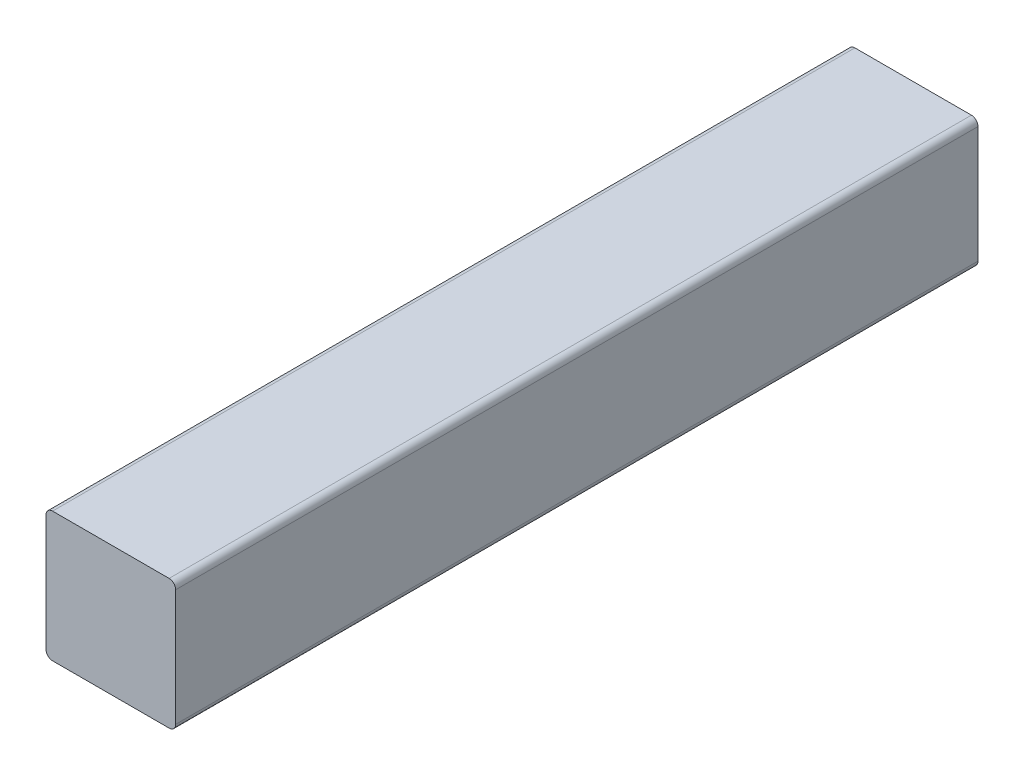
ISO-10303-21;
HEADER;
FILE_DESCRIPTION(('STEP AP214'),'2;1');
FILE_NAME('part.step','',(''),(''),'','','');
FILE_SCHEMA(('AUTOMOTIVE_DESIGN { 1 0 10303 214 1 1 1 1 }'));
ENDSEC;
DATA;
#1=APPLICATION_CONTEXT('core data for automotive mechanical design processes');
#2=APPLICATION_PROTOCOL_DEFINITION('international standard','automotive_design',2000,#1);
#3=PRODUCT_CONTEXT('',#1,'mechanical');
#4=PRODUCT('Part','Part','',(#3));
#5=PRODUCT_RELATED_PRODUCT_CATEGORY('part','',(#4));
#6=PRODUCT_DEFINITION_FORMATION('','',#4);
#7=PRODUCT_DEFINITION_CONTEXT('part definition',#1,'design');
#8=PRODUCT_DEFINITION('design','',#6,#7);
#9=PRODUCT_DEFINITION_SHAPE('','',#8);
#10=(LENGTH_UNIT() NAMED_UNIT(*) SI_UNIT(.MILLI.,.METRE.));
#11=(NAMED_UNIT(*) PLANE_ANGLE_UNIT() SI_UNIT($,.RADIAN.));
#12=(NAMED_UNIT(*) SI_UNIT($,.STERADIAN.) SOLID_ANGLE_UNIT());
#13=UNCERTAINTY_MEASURE_WITH_UNIT(LENGTH_MEASURE(1.E-05),#10,'distance_accuracy_value','');
#14=(GEOMETRIC_REPRESENTATION_CONTEXT(3) GLOBAL_UNCERTAINTY_ASSIGNED_CONTEXT((#13)) GLOBAL_UNIT_ASSIGNED_CONTEXT((#10,
#11,#12)) REPRESENTATION_CONTEXT('',''));
#15=CARTESIAN_POINT('',(0.,0.,0.));
#16=DIRECTION('',(0.,0.,1.));
#17=DIRECTION('',(1.,0.,0.));
#18=AXIS2_PLACEMENT_3D('',#15,#16,#17);
#19=CARTESIAN_POINT('',(10.033,10.033,62.0776));
#20=DIRECTION('',(-1.,0.,0.));
#21=DIRECTION('',(0.,0.,1.));
#22=AXIS2_PLACEMENT_3D('',#19,#20,#21);
#23=PLANE('',#22);
#24=DIRECTION('',(0.,1.,0.));
#25=VECTOR('',#24,1.);
#26=CARTESIAN_POINT('',(10.033,10.033,62.0776));
#27=LINE('',#26,#25);
#28=CARTESIAN_POINT('',(10.033,-9.017,62.0776));
#29=VERTEX_POINT('',#28);
#30=CARTESIAN_POINT('',(10.033,9.017,62.0776));
#31=VERTEX_POINT('',#30);
#32=EDGE_CURVE('E128',#29,#31,#27,.T.);
#33=ORIENTED_EDGE('',*,*,#32,.F.);
#34=DIRECTION('',(0.,0.,-1.));
#35=VECTOR('',#34,1.);
#36=CARTESIAN_POINT('',(10.033,-9.017,62.0776));
#37=LINE('',#36,#35);
#38=CARTESIAN_POINT('',(10.033,-9.017,-62.0776));
#39=VERTEX_POINT('',#38);
#40=EDGE_CURVE('E154',#29,#39,#37,.T.);
#41=ORIENTED_EDGE('',*,*,#40,.T.);
#42=DIRECTION('',(0.,1.,0.));
#43=VECTOR('',#42,1.);
#44=CARTESIAN_POINT('',(10.033,10.033,-62.0776));
#45=LINE('',#44,#43);
#46=CARTESIAN_POINT('',(10.033,9.017,-62.0776));
#47=VERTEX_POINT('',#46);
#48=EDGE_CURVE('E162',#39,#47,#45,.T.);
#49=ORIENTED_EDGE('',*,*,#48,.T.);
#50=DIRECTION('',(0.,0.,-1.));
#51=VECTOR('',#50,1.);
#52=CARTESIAN_POINT('',(10.033,9.017,62.0776));
#53=LINE('',#52,#51);
#54=EDGE_CURVE('E152',#47,#31,#53,.F.);
#55=ORIENTED_EDGE('',*,*,#54,.T.);
#56=EDGE_LOOP('',(#33,#41,#49,#55));
#57=FACE_BOUND('',#56,.T.);
#58=ADVANCED_FACE('F37',(#57),#23,.F.);
#59=CARTESIAN_POINT('',(-10.033,10.033,62.0776));
#60=DIRECTION('',(0.,-1.,0.));
#61=DIRECTION('',(0.,0.,-1.));
#62=AXIS2_PLACEMENT_3D('',#59,#60,#61);
#63=PLANE('',#62);
#64=DIRECTION('',(-1.,0.,0.));
#65=VECTOR('',#64,1.);
#66=CARTESIAN_POINT('',(-10.033,10.033,-62.0776));
#67=LINE('',#66,#65);
#68=CARTESIAN_POINT('',(9.017,10.033,-62.0776));
#69=VERTEX_POINT('',#68);
#70=CARTESIAN_POINT('',(-9.01700000000001,10.033,-62.0776));
#71=VERTEX_POINT('',#70);
#72=EDGE_CURVE('E133',#69,#71,#67,.T.);
#73=ORIENTED_EDGE('',*,*,#72,.T.);
#74=DIRECTION('',(0.,0.,-1.));
#75=VECTOR('',#74,1.);
#76=CARTESIAN_POINT('',(-9.01700000000001,10.033,62.0776));
#77=LINE('',#76,#75);
#78=CARTESIAN_POINT('',(-9.01700000000001,10.033,62.0776));
#79=VERTEX_POINT('',#78);
#80=EDGE_CURVE('E11',#71,#79,#77,.F.);
#81=ORIENTED_EDGE('',*,*,#80,.T.);
#82=DIRECTION('',(-1.,0.,0.));
#83=VECTOR('',#82,1.);
#84=CARTESIAN_POINT('',(-10.033,10.033,62.0776));
#85=LINE('',#84,#83);
#86=CARTESIAN_POINT('',(9.017,10.033,62.0776));
#87=VERTEX_POINT('',#86);
#88=EDGE_CURVE('E131',#87,#79,#85,.T.);
#89=ORIENTED_EDGE('',*,*,#88,.F.);
#90=DIRECTION('',(0.,0.,-1.));
#91=VECTOR('',#90,1.);
#92=CARTESIAN_POINT('',(9.017,10.033,62.0776));
#93=LINE('',#92,#91);
#94=EDGE_CURVE('E45',#87,#69,#93,.T.);
#95=ORIENTED_EDGE('',*,*,#94,.T.);
#96=EDGE_LOOP('',(#73,#81,#89,#95));
#97=FACE_BOUND('',#96,.T.);
#98=ADVANCED_FACE('F159',(#97),#63,.F.);
#99=CARTESIAN_POINT('',(-10.033,10.033,62.0776));
#100=DIRECTION('',(1.,0.,0.));
#101=DIRECTION('',(0.,1.,0.));
#102=AXIS2_PLACEMENT_3D('',#99,#100,#101);
#103=PLANE('',#102);
#104=DIRECTION('',(0.,-1.,0.));
#105=VECTOR('',#104,1.);
#106=CARTESIAN_POINT('',(-10.033,10.033,-62.0776));
#107=LINE('',#106,#105);
#108=CARTESIAN_POINT('',(-10.033,9.017,-62.0776));
#109=VERTEX_POINT('',#108);
#110=CARTESIAN_POINT('',(-10.033,-9.017,-62.0776));
#111=VERTEX_POINT('',#110);
#112=EDGE_CURVE('E129',#109,#111,#107,.T.);
#113=ORIENTED_EDGE('',*,*,#112,.T.);
#114=DIRECTION('',(0.,0.,-1.));
#115=VECTOR('',#114,1.);
#116=CARTESIAN_POINT('',(-10.033,-9.017,62.0776));
#117=LINE('',#116,#115);
#118=CARTESIAN_POINT('',(-10.033,-9.017,62.0776));
#119=VERTEX_POINT('',#118);
#120=EDGE_CURVE('E107',#111,#119,#117,.F.);
#121=ORIENTED_EDGE('',*,*,#120,.T.);
#122=DIRECTION('',(0.,-1.,0.));
#123=VECTOR('',#122,1.);
#124=CARTESIAN_POINT('',(-10.033,10.033,62.0776));
#125=LINE('',#124,#123);
#126=CARTESIAN_POINT('',(-10.033,9.017,62.0776));
#127=VERTEX_POINT('',#126);
#128=EDGE_CURVE('E166',#127,#119,#125,.T.);
#129=ORIENTED_EDGE('',*,*,#128,.F.);
#130=DIRECTION('',(0.,0.,-1.));
#131=VECTOR('',#130,1.);
#132=CARTESIAN_POINT('',(-10.033,9.017,62.0776));
#133=LINE('',#132,#131);
#134=EDGE_CURVE('E112',#127,#109,#133,.T.);
#135=ORIENTED_EDGE('',*,*,#134,.T.);
#136=EDGE_LOOP('',(#113,#121,#129,#135));
#137=FACE_BOUND('',#136,.T.);
#138=ADVANCED_FACE('F176',(#137),#103,.F.);
#139=CARTESIAN_POINT('',(-10.033,-10.033,62.0776));
#140=DIRECTION('',(0.,1.,0.));
#141=DIRECTION('',(0.,0.,1.));
#142=AXIS2_PLACEMENT_3D('',#139,#140,#141);
#143=PLANE('',#142);
#144=DIRECTION('',(1.,0.,0.));
#145=VECTOR('',#144,1.);
#146=CARTESIAN_POINT('',(-10.033,-10.033,62.0776));
#147=LINE('',#146,#145);
#148=CARTESIAN_POINT('',(-9.017,-10.033,62.0776));
#149=VERTEX_POINT('',#148);
#150=CARTESIAN_POINT('',(9.01699999999999,-10.033,62.0776));
#151=VERTEX_POINT('',#150);
#152=EDGE_CURVE('E122',#149,#151,#147,.T.);
#153=ORIENTED_EDGE('',*,*,#152,.F.);
#154=DIRECTION('',(0.,0.,-1.));
#155=VECTOR('',#154,1.);
#156=CARTESIAN_POINT('',(-9.017,-10.033,62.0776));
#157=LINE('',#156,#155);
#158=CARTESIAN_POINT('',(-9.017,-10.033,-62.0776));
#159=VERTEX_POINT('',#158);
#160=EDGE_CURVE('E106',#149,#159,#157,.T.);
#161=ORIENTED_EDGE('',*,*,#160,.T.);
#162=DIRECTION('',(1.,0.,0.));
#163=VECTOR('',#162,1.);
#164=CARTESIAN_POINT('',(-10.033,-10.033,-62.0776));
#165=LINE('',#164,#163);
#166=CARTESIAN_POINT('',(9.01699999999999,-10.033,-62.0776));
#167=VERTEX_POINT('',#166);
#168=EDGE_CURVE('E119',#159,#167,#165,.T.);
#169=ORIENTED_EDGE('',*,*,#168,.T.);
#170=DIRECTION('',(0.,0.,-1.));
#171=VECTOR('',#170,1.);
#172=CARTESIAN_POINT('',(9.01699999999999,-10.033,62.0776));
#173=LINE('',#172,#171);
#174=EDGE_CURVE('E124',#167,#151,#173,.F.);
#175=ORIENTED_EDGE('',*,*,#174,.T.);
#176=EDGE_LOOP('',(#153,#161,#169,#175));
#177=FACE_BOUND('',#176,.T.);
#178=ADVANCED_FACE('F118',(#177),#143,.F.);
#179=CARTESIAN_POINT('',(0.,0.,62.0776));
#180=DIRECTION('',(0.,0.,1.));
#181=DIRECTION('',(1.,0.,0.));
#182=AXIS2_PLACEMENT_3D('',#179,#180,#181);
#183=PLANE('',#182);
#184=ORIENTED_EDGE('',*,*,#128,.T.);
#185=CARTESIAN_POINT('',(-9.017,-9.017,62.0776));
#186=DIRECTION('',(0.,0.,1.));
#187=DIRECTION('',(1.,0.,0.));
#188=AXIS2_PLACEMENT_3D('',#185,#186,#187);
#189=CIRCLE('',#188,1.016);
#190=EDGE_CURVE('E150',#119,#149,#189,.T.);
#191=ORIENTED_EDGE('',*,*,#190,.T.);
#192=ORIENTED_EDGE('',*,*,#152,.T.);
#193=CARTESIAN_POINT('',(9.017,-9.017,62.0776));
#194=DIRECTION('',(0.,0.,1.));
#195=DIRECTION('',(1.,0.,0.));
#196=AXIS2_PLACEMENT_3D('',#193,#194,#195);
#197=CIRCLE('',#196,1.016);
#198=EDGE_CURVE('E148',#151,#29,#197,.T.);
#199=ORIENTED_EDGE('',*,*,#198,.T.);
#200=ORIENTED_EDGE('',*,*,#32,.T.);
#201=CARTESIAN_POINT('',(9.017,9.017,62.0776));
#202=DIRECTION('',(0.,0.,1.));
#203=DIRECTION('',(1.,0.,0.));
#204=AXIS2_PLACEMENT_3D('',#201,#202,#203);
#205=CIRCLE('',#204,1.016);
#206=EDGE_CURVE('E57',#31,#87,#205,.T.);
#207=ORIENTED_EDGE('',*,*,#206,.T.);
#208=ORIENTED_EDGE('',*,*,#88,.T.);
#209=CARTESIAN_POINT('',(-9.01700000000001,9.017,62.0776));
#210=DIRECTION('',(0.,0.,1.));
#211=DIRECTION('',(1.,0.,0.));
#212=AXIS2_PLACEMENT_3D('',#209,#210,#211);
#213=CIRCLE('',#212,1.016);
#214=EDGE_CURVE('E146',#79,#127,#213,.T.);
#215=ORIENTED_EDGE('',*,*,#214,.T.);
#216=EDGE_LOOP('',(#184,#191,#192,#199,#200,#207,#208,#215));
#217=FACE_BOUND('',#216,.T.);
#218=ADVANCED_FACE('F170',(#217),#183,.T.);
#219=CARTESIAN_POINT('',(0.,0.,-62.0776));
#220=DIRECTION('',(0.,0.,1.));
#221=DIRECTION('',(1.,0.,0.));
#222=AXIS2_PLACEMENT_3D('',#219,#220,#221);
#223=PLANE('',#222);
#224=ORIENTED_EDGE('',*,*,#168,.F.);
#225=CARTESIAN_POINT('',(-9.017,-9.017,-62.0776));
#226=DIRECTION('',(0.,0.,1.));
#227=DIRECTION('',(1.,0.,0.));
#228=AXIS2_PLACEMENT_3D('',#225,#226,#227);
#229=CIRCLE('',#228,1.016);
#230=EDGE_CURVE('E102',#159,#111,#229,.F.);
#231=ORIENTED_EDGE('',*,*,#230,.T.);
#232=ORIENTED_EDGE('',*,*,#112,.F.);
#233=CARTESIAN_POINT('',(-9.01700000000001,9.017,-62.0776));
#234=DIRECTION('',(0.,0.,1.));
#235=DIRECTION('',(1.,0.,0.));
#236=AXIS2_PLACEMENT_3D('',#233,#234,#235);
#237=CIRCLE('',#236,1.016);
#238=EDGE_CURVE('E139',#109,#71,#237,.F.);
#239=ORIENTED_EDGE('',*,*,#238,.T.);
#240=ORIENTED_EDGE('',*,*,#72,.F.);
#241=CARTESIAN_POINT('',(9.017,9.017,-62.0776));
#242=DIRECTION('',(0.,0.,1.));
#243=DIRECTION('',(1.,0.,0.));
#244=AXIS2_PLACEMENT_3D('',#241,#242,#243);
#245=CIRCLE('',#244,1.016);
#246=EDGE_CURVE('E123',#69,#47,#245,.F.);
#247=ORIENTED_EDGE('',*,*,#246,.T.);
#248=ORIENTED_EDGE('',*,*,#48,.F.);
#249=CARTESIAN_POINT('',(9.017,-9.017,-62.0776));
#250=DIRECTION('',(0.,0.,1.));
#251=DIRECTION('',(1.,0.,0.));
#252=AXIS2_PLACEMENT_3D('',#249,#250,#251);
#253=CIRCLE('',#252,1.016);
#254=EDGE_CURVE('E113',#39,#167,#253,.F.);
#255=ORIENTED_EDGE('',*,*,#254,.T.);
#256=EDGE_LOOP('',(#224,#231,#232,#239,#240,#247,#248,#255));
#257=FACE_BOUND('',#256,.T.);
#258=ADVANCED_FACE('F126',(#257),#223,.F.);
#259=CARTESIAN_POINT('',(-9.017,-9.017,62.0776));
#260=DIRECTION('',(0.,0.,-1.));
#261=DIRECTION('',(-1.,0.,0.));
#262=AXIS2_PLACEMENT_3D('',#259,#260,#261);
#263=CYLINDRICAL_SURFACE('',#262,1.016);
#264=ORIENTED_EDGE('',*,*,#190,.F.);
#265=ORIENTED_EDGE('',*,*,#120,.F.);
#266=ORIENTED_EDGE('',*,*,#230,.F.);
#267=ORIENTED_EDGE('',*,*,#160,.F.);
#268=EDGE_LOOP('',(#264,#265,#266,#267));
#269=FACE_BOUND('',#268,.T.);
#270=ADVANCED_FACE('F105',(#269),#263,.T.);
#271=CARTESIAN_POINT('',(9.017,-9.017,62.0776));
#272=DIRECTION('',(0.,0.,-1.));
#273=DIRECTION('',(-1.,0.,0.));
#274=AXIS2_PLACEMENT_3D('',#271,#272,#273);
#275=CYLINDRICAL_SURFACE('',#274,1.016);
#276=ORIENTED_EDGE('',*,*,#198,.F.);
#277=ORIENTED_EDGE('',*,*,#174,.F.);
#278=ORIENTED_EDGE('',*,*,#254,.F.);
#279=ORIENTED_EDGE('',*,*,#40,.F.);
#280=EDGE_LOOP('',(#276,#277,#278,#279));
#281=FACE_BOUND('',#280,.T.);
#282=ADVANCED_FACE('F181',(#281),#275,.T.);
#283=CARTESIAN_POINT('',(-9.01700000000001,9.017,62.0776));
#284=DIRECTION('',(0.,0.,-1.));
#285=DIRECTION('',(-1.,0.,0.));
#286=AXIS2_PLACEMENT_3D('',#283,#284,#285);
#287=CYLINDRICAL_SURFACE('',#286,1.016);
#288=ORIENTED_EDGE('',*,*,#214,.F.);
#289=ORIENTED_EDGE('',*,*,#80,.F.);
#290=ORIENTED_EDGE('',*,*,#238,.F.);
#291=ORIENTED_EDGE('',*,*,#134,.F.);
#292=EDGE_LOOP('',(#288,#289,#290,#291));
#293=FACE_BOUND('',#292,.T.);
#294=ADVANCED_FACE('F174',(#293),#287,.T.);
#295=CARTESIAN_POINT('',(9.017,9.017,62.0776));
#296=DIRECTION('',(0.,0.,-1.));
#297=DIRECTION('',(-1.,0.,0.));
#298=AXIS2_PLACEMENT_3D('',#295,#296,#297);
#299=CYLINDRICAL_SURFACE('',#298,1.016);
#300=ORIENTED_EDGE('',*,*,#206,.F.);
#301=ORIENTED_EDGE('',*,*,#54,.F.);
#302=ORIENTED_EDGE('',*,*,#246,.F.);
#303=ORIENTED_EDGE('',*,*,#94,.F.);
#304=EDGE_LOOP('',(#300,#301,#302,#303));
#305=FACE_BOUND('',#304,.T.);
#306=ADVANCED_FACE('F39',(#305),#299,.T.);
#307=CLOSED_SHELL('',(#58,#98,#138,#178,#218,#258,#270,#282,#294,#306));
#308=MANIFOLD_SOLID_BREP('B2',#307);
#309=ADVANCED_BREP_SHAPE_REPRESENTATION('',(#18,#308),#14);
#310=SHAPE_DEFINITION_REPRESENTATION(#9,#309);
ENDSEC;
END-ISO-10303-21;
